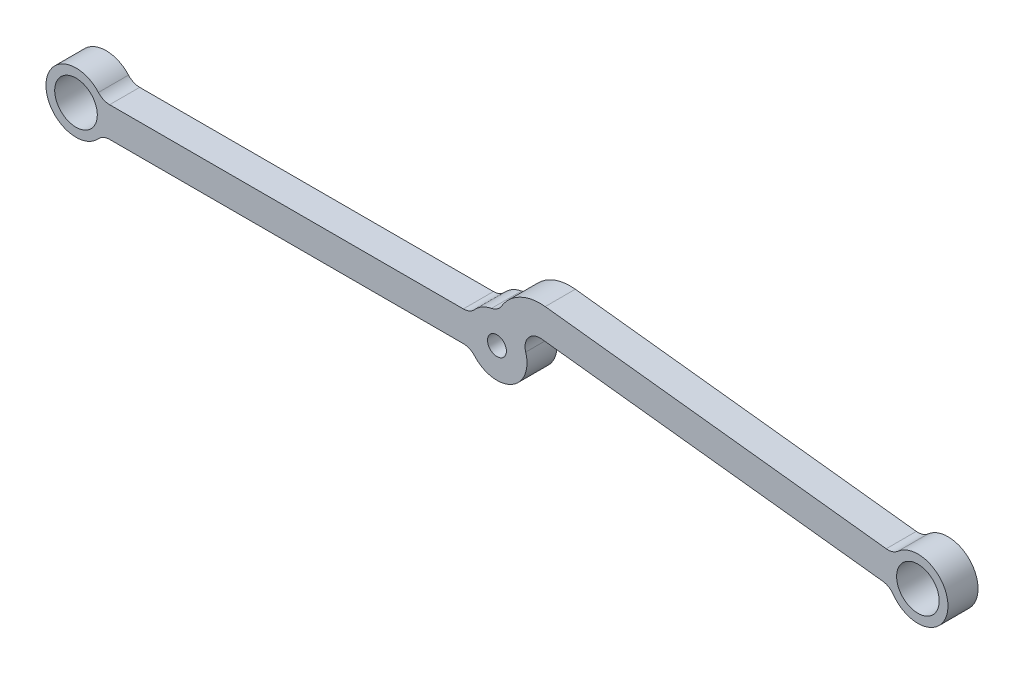
ISO-10303-21;
HEADER;
FILE_DESCRIPTION(('STEP AP214'),'2;1');
FILE_NAME('part.step','',(''),(''),'','','');
FILE_SCHEMA(('AUTOMOTIVE_DESIGN { 1 0 10303 214 1 1 1 1 }'));
ENDSEC;
DATA;
#1=APPLICATION_CONTEXT('core data for automotive mechanical design processes');
#2=APPLICATION_PROTOCOL_DEFINITION('international standard','automotive_design',2000,#1);
#3=PRODUCT_CONTEXT('',#1,'mechanical');
#4=PRODUCT('Part','Part','',(#3));
#5=PRODUCT_RELATED_PRODUCT_CATEGORY('part','',(#4));
#6=PRODUCT_DEFINITION_FORMATION('','',#4);
#7=PRODUCT_DEFINITION_CONTEXT('part definition',#1,'design');
#8=PRODUCT_DEFINITION('design','',#6,#7);
#9=PRODUCT_DEFINITION_SHAPE('','',#8);
#10=(LENGTH_UNIT() NAMED_UNIT(*) SI_UNIT(.MILLI.,.METRE.));
#11=(NAMED_UNIT(*) PLANE_ANGLE_UNIT() SI_UNIT($,.RADIAN.));
#12=(NAMED_UNIT(*) SI_UNIT($,.STERADIAN.) SOLID_ANGLE_UNIT());
#13=UNCERTAINTY_MEASURE_WITH_UNIT(LENGTH_MEASURE(1.E-05),#10,'distance_accuracy_value','');
#14=(GEOMETRIC_REPRESENTATION_CONTEXT(3) GLOBAL_UNCERTAINTY_ASSIGNED_CONTEXT((#13)) GLOBAL_UNIT_ASSIGNED_CONTEXT((#10,
#11,#12)) REPRESENTATION_CONTEXT('',''));
#15=CARTESIAN_POINT('',(0.,0.,0.));
#16=DIRECTION('',(0.,0.,1.));
#17=DIRECTION('',(1.,0.,0.));
#18=AXIS2_PLACEMENT_3D('',#15,#16,#17);
#19=CARTESIAN_POINT('',(0.79828571428571,6.93923374144195,6.35));
#20=DIRECTION('',(-0.114285714285715,-0.993447922897926,0.));
#21=DIRECTION('',(0.993447922897926,-0.114285714285715,0.));
#22=AXIS2_PLACEMENT_3D('',#19,#20,#21);
#23=PLANE('',#22);
#24=DIRECTION('',(-0.993447922897926,0.114285714285715,0.));
#25=VECTOR('',#24,1.);
#26=CARTESIAN_POINT('',(0.79828571428571,6.93923374144195,0.));
#27=LINE('',#26,#25);
#28=CARTESIAN_POINT('',(81.4841436036763,-2.342823917651,0.));
#29=VERTEX_POINT('',#28);
#30=CARTESIAN_POINT('',(9.47089404659922,5.941541547283,0.));
#31=VERTEX_POINT('',#30);
#32=EDGE_CURVE('E292',#29,#31,#27,.T.);
#33=ORIENTED_EDGE('',*,*,#32,.F.);
#34=DIRECTION('',(0.,0.,-1.));
#35=VECTOR('',#34,1.);
#36=CARTESIAN_POINT('',(81.4841436036763,-2.34282391765099,6.35));
#37=LINE('',#36,#35);
#38=CARTESIAN_POINT('',(81.4841436036763,-2.342823917651,6.35));
#39=VERTEX_POINT('',#38);
#40=EDGE_CURVE('E203',#29,#39,#37,.F.);
#41=ORIENTED_EDGE('',*,*,#40,.T.);
#42=DIRECTION('',(-0.993447922897926,0.114285714285715,0.));
#43=VECTOR('',#42,1.);
#44=CARTESIAN_POINT('',(0.79828571428571,6.93923374144195,6.35));
#45=LINE('',#44,#43);
#46=CARTESIAN_POINT('',(9.47089404659922,5.941541547283,6.35));
#47=VERTEX_POINT('',#46);
#48=EDGE_CURVE('E321',#39,#47,#45,.T.);
#49=ORIENTED_EDGE('',*,*,#48,.T.);
#50=DIRECTION('',(0.,0.,-1.));
#51=VECTOR('',#50,1.);
#52=CARTESIAN_POINT('',(9.47089404659922,5.941541547283,6.35));
#53=LINE('',#52,#51);
#54=EDGE_CURVE('E195',#47,#31,#53,.T.);
#55=ORIENTED_EDGE('',*,*,#54,.T.);
#56=EDGE_LOOP('',(#33,#41,#49,#55));
#57=FACE_BOUND('',#56,.T.);
#58=ADVANCED_FACE('F42',(#57),#23,.T.);
#59=CARTESIAN_POINT('',(88.8999999999991,0.,6.35));
#60=DIRECTION('',(0.,0.,-1.));
#61=DIRECTION('',(-1.,0.,0.));
#62=AXIS2_PLACEMENT_3D('',#59,#60,#61);
#63=CYLINDRICAL_SURFACE('',#62,6.35);
#64=CARTESIAN_POINT('',(88.8999999999991,0.,0.));
#65=DIRECTION('',(0.,0.,1.));
#66=DIRECTION('',(1.,0.,0.));
#67=AXIS2_PLACEMENT_3D('',#64,#65,#66);
#68=CIRCLE('',#67,6.35);
#69=CARTESIAN_POINT('',(83.7141909738791,-3.6646807152346,0.));
#70=VERTEX_POINT('',#69);
#71=CARTESIAN_POINT('',(84.6818100214982,4.7465116986345,0.));
#72=VERTEX_POINT('',#71);
#73=EDGE_CURVE('E294',#70,#72,#68,.T.);
#74=ORIENTED_EDGE('',*,*,#73,.T.);
#75=DIRECTION('',(0.,0.,-1.));
#76=VECTOR('',#75,1.);
#77=CARTESIAN_POINT('',(84.6818100214982,4.7465116986345,6.35));
#78=LINE('',#77,#76);
#79=CARTESIAN_POINT('',(84.6818100214982,4.7465116986345,6.35));
#80=VERTEX_POINT('',#79);
#81=EDGE_CURVE('E201',#72,#80,#78,.F.);
#82=ORIENTED_EDGE('',*,*,#81,.T.);
#83=CARTESIAN_POINT('',(88.8999999999991,0.,6.35));
#84=DIRECTION('',(0.,0.,1.));
#85=DIRECTION('',(1.,0.,0.));
#86=AXIS2_PLACEMENT_3D('',#83,#84,#85);
#87=CIRCLE('',#86,6.35);
#88=CARTESIAN_POINT('',(83.7141909738791,-3.6646807152346,6.35));
#89=VERTEX_POINT('',#88);
#90=EDGE_CURVE('E174',#89,#80,#87,.T.);
#91=ORIENTED_EDGE('',*,*,#90,.F.);
#92=DIRECTION('',(0.,0.,-1.));
#93=VECTOR('',#92,1.);
#94=CARTESIAN_POINT('',(83.7141909738791,-3.6646807152346,6.35));
#95=LINE('',#94,#93);
#96=EDGE_CURVE('E192',#89,#70,#95,.T.);
#97=ORIENTED_EDGE('',*,*,#96,.T.);
#98=EDGE_LOOP('',(#74,#82,#91,#97));
#99=FACE_BOUND('',#98,.T.);
#100=ADVANCED_FACE('F333',(#99),#63,.T.);
#101=CARTESIAN_POINT('',(1.524,13.2476280518438,6.35));
#102=DIRECTION('',(-0.114285714285715,-0.993447922897926,0.));
#103=DIRECTION('',(0.993447922897926,-0.114285714285715,0.));
#104=AXIS2_PLACEMENT_3D('',#101,#102,#103);
#105=PLANE('',#104);
#106=DIRECTION('',(-0.993447922897926,0.114285714285715,0.));
#107=VECTOR('',#106,1.);
#108=CARTESIAN_POINT('',(1.524,13.2476280518438,6.35));
#109=LINE('',#108,#107);
#110=CARTESIAN_POINT('',(82.2098578893906,3.96557039275084,6.35));
#111=VERTEX_POINT('',#110);
#112=CARTESIAN_POINT('',(10.1966083323135,12.2499358576848,6.35));
#113=VERTEX_POINT('',#112);
#114=EDGE_CURVE('E160',#111,#113,#109,.T.);
#115=ORIENTED_EDGE('',*,*,#114,.F.);
#116=DIRECTION('',(0.,0.,1.));
#117=VECTOR('',#116,1.);
#118=CARTESIAN_POINT('',(82.2098578893906,3.96557039275084,0.));
#119=LINE('',#118,#117);
#120=CARTESIAN_POINT('',(82.2098578893906,3.96557039275084,0.));
#121=VERTEX_POINT('',#120);
#122=EDGE_CURVE('E189',#111,#121,#119,.F.);
#123=ORIENTED_EDGE('',*,*,#122,.T.);
#124=DIRECTION('',(-0.993447922897926,0.114285714285715,0.));
#125=VECTOR('',#124,1.);
#126=CARTESIAN_POINT('',(1.524,13.2476280518438,0.));
#127=LINE('',#126,#125);
#128=CARTESIAN_POINT('',(10.1966083323135,12.2499358576848,0.));
#129=VERTEX_POINT('',#128);
#130=EDGE_CURVE('E187',#121,#129,#127,.T.);
#131=ORIENTED_EDGE('',*,*,#130,.T.);
#132=DIRECTION('',(0.,0.,-1.));
#133=VECTOR('',#132,1.);
#134=CARTESIAN_POINT('',(10.1966083323135,12.2499358576848,6.35));
#135=LINE('',#134,#133);
#136=EDGE_CURVE('E180',#113,#129,#135,.T.);
#137=ORIENTED_EDGE('',*,*,#136,.F.);
#138=EDGE_LOOP('',(#115,#123,#131,#137));
#139=FACE_BOUND('',#138,.T.);
#140=ADVANCED_FACE('F185',(#139),#105,.F.);
#141=CARTESIAN_POINT('',(9.10803690374207,2.78734439208206,6.35));
#142=DIRECTION('',(0.,0.,-1.));
#143=DIRECTION('',(-1.,0.,0.));
#144=AXIS2_PLACEMENT_3D('',#141,#142,#143);
#145=CYLINDRICAL_SURFACE('',#144,9.525);
#146=CARTESIAN_POINT('',(9.10803690374207,2.78734439208206,0.));
#147=DIRECTION('',(0.,0.,1.));
#148=DIRECTION('',(1.,0.,0.));
#149=AXIS2_PLACEMENT_3D('',#146,#147,#148);
#150=CIRCLE('',#149,9.525);
#151=CARTESIAN_POINT('',(0.958448455447911,7.71784468347547,0.));
#152=VERTEX_POINT('',#151);
#153=EDGE_CURVE('E298',#129,#152,#150,.T.);
#154=ORIENTED_EDGE('',*,*,#153,.T.);
#155=DIRECTION('',(0.,0.,-1.));
#156=VECTOR('',#155,1.);
#157=CARTESIAN_POINT('',(0.958448455447911,7.71784468347547,6.35));
#158=LINE('',#157,#156);
#159=CARTESIAN_POINT('',(0.958448455447911,7.71784468347547,6.35));
#160=VERTEX_POINT('',#159);
#161=EDGE_CURVE('E182',#152,#160,#158,.F.);
#162=ORIENTED_EDGE('',*,*,#161,.T.);
#163=CARTESIAN_POINT('',(9.10803690374207,2.78734439208206,6.35));
#164=DIRECTION('',(0.,0.,1.));
#165=DIRECTION('',(1.,0.,0.));
#166=AXIS2_PLACEMENT_3D('',#163,#164,#165);
#167=CIRCLE('',#166,9.525);
#168=EDGE_CURVE('E165',#113,#160,#167,.T.);
#169=ORIENTED_EDGE('',*,*,#168,.F.);
#170=ORIENTED_EDGE('',*,*,#136,.T.);
#171=EDGE_LOOP('',(#154,#162,#169,#170));
#172=FACE_BOUND('',#171,.T.);
#173=ADVANCED_FACE('F179',(#172),#145,.T.);
#174=CARTESIAN_POINT('',(-8.60422844084496E-13,0.,6.35));
#175=DIRECTION('',(0.,0.,-1.));
#176=DIRECTION('',(-1.,0.,0.));
#177=AXIS2_PLACEMENT_3D('',#174,#175,#176);
#178=CYLINDRICAL_SURFACE('',#177,6.34999999999994);
#179=CARTESIAN_POINT('',(-8.60422844084496E-13,0.,6.35));
#180=DIRECTION('',(0.,0.,1.));
#181=DIRECTION('',(1.,0.,0.));
#182=AXIS2_PLACEMENT_3D('',#179,#180,#181);
#183=CIRCLE('',#182,6.34999999999994);
#184=CARTESIAN_POINT('',(-1.17205401821149,6.24089652040438,6.35));
#185=VERTEX_POINT('',#184);
#186=CARTESIAN_POINT('',(-4.73301055237538,4.23333333333328,6.35));
#187=VERTEX_POINT('',#186);
#188=EDGE_CURVE('E183',#185,#187,#183,.T.);
#189=ORIENTED_EDGE('',*,*,#188,.F.);
#190=DIRECTION('',(0.,0.,-1.));
#191=VECTOR('',#190,1.);
#192=CARTESIAN_POINT('',(-1.17205401821149,6.24089652040438,6.35));
#193=LINE('',#192,#191);
#194=CARTESIAN_POINT('',(-1.17205401821149,6.24089652040438,0.));
#195=VERTEX_POINT('',#194);
#196=EDGE_CURVE('E207',#185,#195,#193,.T.);
#197=ORIENTED_EDGE('',*,*,#196,.T.);
#198=CARTESIAN_POINT('',(-8.60422844084496E-13,0.,0.));
#199=DIRECTION('',(0.,0.,1.));
#200=DIRECTION('',(1.,0.,0.));
#201=AXIS2_PLACEMENT_3D('',#198,#199,#200);
#202=CIRCLE('',#201,6.34999999999994);
#203=CARTESIAN_POINT('',(-4.73301055237538,4.23333333333328,0.));
#204=VERTEX_POINT('',#203);
#205=EDGE_CURVE('E266',#195,#204,#202,.T.);
#206=ORIENTED_EDGE('',*,*,#205,.T.);
#207=DIRECTION('',(0.,0.,-1.));
#208=VECTOR('',#207,1.);
#209=CARTESIAN_POINT('',(-4.73301055237538,4.23333333333328,6.35));
#210=LINE('',#209,#208);
#211=EDGE_CURVE('E205',#204,#187,#210,.F.);
#212=ORIENTED_EDGE('',*,*,#211,.T.);
#213=EDGE_LOOP('',(#189,#197,#206,#212));
#214=FACE_BOUND('',#213,.T.);
#215=ADVANCED_FACE('F349',(#214),#178,.T.);
#216=CARTESIAN_POINT('',(0.,3.17499999999994,6.35));
#217=DIRECTION('',(0.,1.,0.));
#218=DIRECTION('',(0.,0.,1.));
#219=AXIS2_PLACEMENT_3D('',#216,#217,#218);
#220=PLANE('',#219);
#221=DIRECTION('',(1.,0.,0.));
#222=VECTOR('',#221,1.);
#223=CARTESIAN_POINT('',(0.,3.17499999999994,6.35));
#224=LINE('',#223,#222);
#225=CARTESIAN_POINT('',(-81.800484171439,3.17499999999994,6.35));
#226=VERTEX_POINT('',#225);
#227=CARTESIAN_POINT('',(-7.09951582856267,3.17499999999994,6.35));
#228=VERTEX_POINT('',#227);
#229=EDGE_CURVE('E272',#226,#228,#224,.T.);
#230=ORIENTED_EDGE('',*,*,#229,.T.);
#231=DIRECTION('',(0.,0.,-1.));
#232=VECTOR('',#231,1.);
#233=CARTESIAN_POINT('',(-7.09951582856267,3.17499999999994,6.35));
#234=LINE('',#233,#232);
#235=CARTESIAN_POINT('',(-7.09951582856267,3.17499999999994,0.));
#236=VERTEX_POINT('',#235);
#237=EDGE_CURVE('E213',#228,#236,#234,.T.);
#238=ORIENTED_EDGE('',*,*,#237,.T.);
#239=DIRECTION('',(1.,0.,0.));
#240=VECTOR('',#239,1.);
#241=CARTESIAN_POINT('',(0.,3.17499999999994,0.));
#242=LINE('',#241,#240);
#243=CARTESIAN_POINT('',(-81.800484171439,3.17499999999994,0.));
#244=VERTEX_POINT('',#243);
#245=EDGE_CURVE('E257',#244,#236,#242,.T.);
#246=ORIENTED_EDGE('',*,*,#245,.F.);
#247=DIRECTION('',(0.,0.,-1.));
#248=VECTOR('',#247,1.);
#249=CARTESIAN_POINT('',(-81.800484171439,3.17499999999994,6.35));
#250=LINE('',#249,#248);
#251=EDGE_CURVE('E211',#244,#226,#250,.F.);
#252=ORIENTED_EDGE('',*,*,#251,.T.);
#253=EDGE_LOOP('',(#230,#238,#246,#252));
#254=FACE_BOUND('',#253,.T.);
#255=ADVANCED_FACE('F264',(#254),#220,.T.);
#256=CARTESIAN_POINT('',(-88.9000000000009,0.,6.35));
#257=DIRECTION('',(0.,0.,-1.));
#258=DIRECTION('',(-1.,0.,0.));
#259=AXIS2_PLACEMENT_3D('',#256,#257,#258);
#260=CYLINDRICAL_SURFACE('',#259,6.35);
#261=CARTESIAN_POINT('',(-88.9000000000009,0.,0.));
#262=DIRECTION('',(0.,0.,1.));
#263=DIRECTION('',(1.,0.,0.));
#264=AXIS2_PLACEMENT_3D('',#261,#262,#263);
#265=CIRCLE('',#264,6.35);
#266=CARTESIAN_POINT('',(-84.1669894476263,4.23333333333326,0.));
#267=VERTEX_POINT('',#266);
#268=CARTESIAN_POINT('',(-84.1669894476263,-4.23333333333339,0.));
#269=VERTEX_POINT('',#268);
#270=EDGE_CURVE('E258',#267,#269,#265,.T.);
#271=ORIENTED_EDGE('',*,*,#270,.T.);
#272=DIRECTION('',(0.,0.,-1.));
#273=VECTOR('',#272,1.);
#274=CARTESIAN_POINT('',(-84.1669894476263,-4.23333333333339,6.35));
#275=LINE('',#274,#273);
#276=CARTESIAN_POINT('',(-84.1669894476263,-4.23333333333339,6.35));
#277=VERTEX_POINT('',#276);
#278=EDGE_CURVE('E57',#269,#277,#275,.F.);
#279=ORIENTED_EDGE('',*,*,#278,.T.);
#280=CARTESIAN_POINT('',(-88.9000000000009,0.,6.35));
#281=DIRECTION('',(0.,0.,1.));
#282=DIRECTION('',(1.,0.,0.));
#283=AXIS2_PLACEMENT_3D('',#280,#281,#282);
#284=CIRCLE('',#283,6.35);
#285=CARTESIAN_POINT('',(-84.1669894476263,4.23333333333326,6.35));
#286=VERTEX_POINT('',#285);
#287=EDGE_CURVE('E269',#286,#277,#284,.T.);
#288=ORIENTED_EDGE('',*,*,#287,.F.);
#289=DIRECTION('',(0.,0.,-1.));
#290=VECTOR('',#289,1.);
#291=CARTESIAN_POINT('',(-84.1669894476263,4.23333333333326,6.35));
#292=LINE('',#291,#290);
#293=EDGE_CURVE('E224',#286,#267,#292,.T.);
#294=ORIENTED_EDGE('',*,*,#293,.T.);
#295=EDGE_LOOP('',(#271,#279,#288,#294));
#296=FACE_BOUND('',#295,.T.);
#297=ADVANCED_FACE('F268',(#296),#260,.T.);
#298=CARTESIAN_POINT('',(0.,-3.17500000000005,6.35));
#299=DIRECTION('',(0.,1.,0.));
#300=DIRECTION('',(0.,0.,1.));
#301=AXIS2_PLACEMENT_3D('',#298,#299,#300);
#302=PLANE('',#301);
#303=DIRECTION('',(1.,0.,0.));
#304=VECTOR('',#303,1.);
#305=CARTESIAN_POINT('',(0.,-3.17500000000005,0.));
#306=LINE('',#305,#304);
#307=CARTESIAN_POINT('',(-81.800484171439,-3.17500000000005,0.));
#308=VERTEX_POINT('',#307);
#309=CARTESIAN_POINT('',(-7.09951582856257,-3.17500000000005,0.));
#310=VERTEX_POINT('',#309);
#311=EDGE_CURVE('E302',#308,#310,#306,.T.);
#312=ORIENTED_EDGE('',*,*,#311,.T.);
#313=DIRECTION('',(0.,0.,1.));
#314=VECTOR('',#313,1.);
#315=CARTESIAN_POINT('',(-7.09951582856257,-3.17500000000005,6.35));
#316=LINE('',#315,#314);
#317=CARTESIAN_POINT('',(-7.09951582856257,-3.17500000000005,6.35));
#318=VERTEX_POINT('',#317);
#319=EDGE_CURVE('E222',#310,#318,#316,.T.);
#320=ORIENTED_EDGE('',*,*,#319,.T.);
#321=DIRECTION('',(1.,0.,0.));
#322=VECTOR('',#321,1.);
#323=CARTESIAN_POINT('',(0.,-3.17500000000005,6.35));
#324=LINE('',#323,#322);
#325=CARTESIAN_POINT('',(-81.800484171439,-3.17500000000005,6.35));
#326=VERTEX_POINT('',#325);
#327=EDGE_CURVE('E271',#326,#318,#324,.T.);
#328=ORIENTED_EDGE('',*,*,#327,.F.);
#329=DIRECTION('',(0.,0.,1.));
#330=VECTOR('',#329,1.);
#331=CARTESIAN_POINT('',(-81.800484171439,-3.17500000000005,0.));
#332=LINE('',#331,#330);
#333=EDGE_CURVE('E219',#326,#308,#332,.F.);
#334=ORIENTED_EDGE('',*,*,#333,.T.);
#335=EDGE_LOOP('',(#312,#320,#328,#334));
#336=FACE_BOUND('',#335,.T.);
#337=ADVANCED_FACE('F399',(#336),#302,.F.);
#338=CARTESIAN_POINT('',(-4.73301055237532,-4.23333333333336,6.35));
#339=VERTEX_POINT('',#338);
#340=CARTESIAN_POINT('',(6.07202460249415,1.85822959472129,6.35));
#341=VERTEX_POINT('',#340);
#342=EDGE_CURVE('E275',#339,#341,#183,.T.);
#343=ORIENTED_EDGE('',*,*,#342,.F.);
#344=DIRECTION('',(0.,0.,-1.));
#345=VECTOR('',#344,1.);
#346=CARTESIAN_POINT('',(-4.73301055237532,-4.23333333333336,6.35));
#347=LINE('',#346,#345);
#348=CARTESIAN_POINT('',(-4.73301055237532,-4.23333333333336,0.));
#349=VERTEX_POINT('',#348);
#350=EDGE_CURVE('E216',#339,#349,#347,.T.);
#351=ORIENTED_EDGE('',*,*,#350,.T.);
#352=CARTESIAN_POINT('',(6.07202460249415,1.85822959472129,0.));
#353=VERTEX_POINT('',#352);
#354=EDGE_CURVE('E300',#349,#353,#202,.T.);
#355=ORIENTED_EDGE('',*,*,#354,.T.);
#356=DIRECTION('',(0.,0.,-1.));
#357=VECTOR('',#356,1.);
#358=CARTESIAN_POINT('',(6.07202460249415,1.85822959472129,6.35));
#359=LINE('',#358,#357);
#360=EDGE_CURVE('E190',#341,#353,#359,.T.);
#361=ORIENTED_EDGE('',*,*,#360,.F.);
#362=EDGE_LOOP('',(#343,#351,#355,#361));
#363=FACE_BOUND('',#362,.T.);
#364=ADVANCED_FACE('F394',(#363),#178,.T.);
#365=CARTESIAN_POINT('',(-8.60422844084496E-13,0.,6.35));
#366=DIRECTION('',(0.,0.,-1.));
#367=DIRECTION('',(-1.,0.,0.));
#368=AXIS2_PLACEMENT_3D('',#365,#366,#367);
#369=CYLINDRICAL_SURFACE('',#368,1.9939);
#370=CARTESIAN_POINT('',(-8.60422844084496E-13,0.,6.35));
#371=DIRECTION('',(0.,0.,1.));
#372=DIRECTION('',(1.,0.,0.));
#373=AXIS2_PLACEMENT_3D('',#370,#371,#372);
#374=CIRCLE('',#373,1.9939);
#375=CARTESIAN_POINT('',(1.99389999999914,0.,6.35));
#376=VERTEX_POINT('',#375);
#377=EDGE_CURVE('E283',#376,#376,#374,.T.);
#378=ORIENTED_EDGE('',*,*,#377,.T.);
#379=EDGE_LOOP('',(#378));
#380=FACE_BOUND('',#379,.T.);
#381=CARTESIAN_POINT('',(-8.60422844084496E-13,0.,0.));
#382=DIRECTION('',(0.,0.,1.));
#383=DIRECTION('',(1.,0.,0.));
#384=AXIS2_PLACEMENT_3D('',#381,#382,#383);
#385=CIRCLE('',#384,1.9939);
#386=CARTESIAN_POINT('',(1.99389999999914,0.,0.));
#387=VERTEX_POINT('',#386);
#388=EDGE_CURVE('E309',#387,#387,#385,.T.);
#389=ORIENTED_EDGE('',*,*,#388,.F.);
#390=EDGE_LOOP('',(#389));
#391=FACE_BOUND('',#390,.T.);
#392=ADVANCED_FACE('F381',(#380,#391),#369,.F.);
#393=CARTESIAN_POINT('',(9.10803690374207,2.78734439208206,6.35));
#394=DIRECTION('',(0.,0.,-1.));
#395=DIRECTION('',(-1.,0.,0.));
#396=AXIS2_PLACEMENT_3D('',#393,#394,#395);
#397=CYLINDRICAL_SURFACE('',#396,3.175);
#398=CARTESIAN_POINT('',(9.10803690374207,2.78734439208206,0.));
#399=DIRECTION('',(0.,0.,1.));
#400=DIRECTION('',(1.,0.,0.));
#401=AXIS2_PLACEMENT_3D('',#398,#399,#400);
#402=CIRCLE('',#401,3.175);
#403=EDGE_CURVE('E301',#31,#353,#402,.T.);
#404=ORIENTED_EDGE('',*,*,#403,.F.);
#405=ORIENTED_EDGE('',*,*,#54,.F.);
#406=CARTESIAN_POINT('',(9.10803690374207,2.78734439208206,6.35));
#407=DIRECTION('',(0.,0.,1.));
#408=DIRECTION('',(1.,0.,0.));
#409=AXIS2_PLACEMENT_3D('',#406,#407,#408);
#410=CIRCLE('',#409,3.175);
#411=EDGE_CURVE('E280',#47,#341,#410,.T.);
#412=ORIENTED_EDGE('',*,*,#411,.T.);
#413=ORIENTED_EDGE('',*,*,#360,.T.);
#414=EDGE_LOOP('',(#404,#405,#412,#413));
#415=FACE_BOUND('',#414,.T.);
#416=ADVANCED_FACE('F324',(#415),#397,.F.);
#417=CARTESIAN_POINT('',(88.8999999999991,0.,6.35));
#418=DIRECTION('',(0.,0.,-1.));
#419=DIRECTION('',(-1.,0.,0.));
#420=AXIS2_PLACEMENT_3D('',#417,#418,#419);
#421=CYLINDRICAL_SURFACE('',#420,4.49961);
#422=CARTESIAN_POINT('',(88.8999999999991,0.,6.35));
#423=DIRECTION('',(0.,0.,1.));
#424=DIRECTION('',(1.,0.,0.));
#425=AXIS2_PLACEMENT_3D('',#422,#423,#424);
#426=CIRCLE('',#425,4.49961);
#427=CARTESIAN_POINT('',(93.3996099999991,0.,6.35));
#428=VERTEX_POINT('',#427);
#429=EDGE_CURVE('E314',#428,#428,#426,.T.);
#430=ORIENTED_EDGE('',*,*,#429,.T.);
#431=EDGE_LOOP('',(#430));
#432=FACE_BOUND('',#431,.T.);
#433=CARTESIAN_POINT('',(88.8999999999991,0.,0.));
#434=DIRECTION('',(0.,0.,1.));
#435=DIRECTION('',(1.,0.,0.));
#436=AXIS2_PLACEMENT_3D('',#433,#434,#435);
#437=CIRCLE('',#436,4.49961);
#438=CARTESIAN_POINT('',(93.3996099999991,0.,0.));
#439=VERTEX_POINT('',#438);
#440=EDGE_CURVE('E289',#439,#439,#437,.T.);
#441=ORIENTED_EDGE('',*,*,#440,.F.);
#442=EDGE_LOOP('',(#441));
#443=FACE_BOUND('',#442,.T.);
#444=ADVANCED_FACE('F371',(#432,#443),#421,.F.);
#445=CARTESIAN_POINT('',(-88.9000000000009,0.,6.35));
#446=DIRECTION('',(0.,0.,-1.));
#447=DIRECTION('',(-1.,0.,0.));
#448=AXIS2_PLACEMENT_3D('',#445,#446,#447);
#449=CYLINDRICAL_SURFACE('',#448,4.49961);
#450=CARTESIAN_POINT('',(-88.9000000000009,0.,6.35));
#451=DIRECTION('',(0.,0.,1.));
#452=DIRECTION('',(1.,0.,0.));
#453=AXIS2_PLACEMENT_3D('',#450,#451,#452);
#454=CIRCLE('',#453,4.49961);
#455=CARTESIAN_POINT('',(-84.4003900000009,0.,6.35));
#456=VERTEX_POINT('',#455);
#457=EDGE_CURVE('E286',#456,#456,#454,.T.);
#458=ORIENTED_EDGE('',*,*,#457,.T.);
#459=EDGE_LOOP('',(#458));
#460=FACE_BOUND('',#459,.T.);
#461=CARTESIAN_POINT('',(-88.9000000000009,0.,0.));
#462=DIRECTION('',(0.,0.,1.));
#463=DIRECTION('',(1.,0.,0.));
#464=AXIS2_PLACEMENT_3D('',#461,#462,#463);
#465=CIRCLE('',#464,4.49961);
#466=CARTESIAN_POINT('',(-84.4003900000009,0.,0.));
#467=VERTEX_POINT('',#466);
#468=EDGE_CURVE('E312',#467,#467,#465,.T.);
#469=ORIENTED_EDGE('',*,*,#468,.F.);
#470=EDGE_LOOP('',(#469));
#471=FACE_BOUND('',#470,.T.);
#472=ADVANCED_FACE('F373',(#460,#471),#449,.F.);
#473=CARTESIAN_POINT('',(0.,0.,6.35));
#474=DIRECTION('',(0.,0.,1.));
#475=DIRECTION('',(1.,0.,0.));
#476=AXIS2_PLACEMENT_3D('',#473,#474,#475);
#477=PLANE('',#476);
#478=ORIENTED_EDGE('',*,*,#429,.F.);
#479=EDGE_LOOP('',(#478));
#480=FACE_BOUND('',#479,.T.);
#481=ORIENTED_EDGE('',*,*,#48,.F.);
#482=CARTESIAN_POINT('',(81.1212864608191,-5.4970210728519,6.35));
#483=DIRECTION('',(0.,0.,1.));
#484=DIRECTION('',(1.,0.,0.));
#485=AXIS2_PLACEMENT_3D('',#482,#483,#484);
#486=CIRCLE('',#485,3.175);
#487=EDGE_CURVE('E233',#39,#89,#486,.F.);
#488=ORIENTED_EDGE('',*,*,#487,.T.);
#489=ORIENTED_EDGE('',*,*,#90,.T.);
#490=CARTESIAN_POINT('',(82.5727150322477,7.11976754795176,6.35));
#491=DIRECTION('',(0.,0.,1.));
#492=DIRECTION('',(1.,0.,0.));
#493=AXIS2_PLACEMENT_3D('',#490,#491,#492);
#494=CIRCLE('',#493,3.175);
#495=EDGE_CURVE('E169',#80,#111,#494,.F.);
#496=ORIENTED_EDGE('',*,*,#495,.T.);
#497=ORIENTED_EDGE('',*,*,#114,.T.);
#498=ORIENTED_EDGE('',*,*,#168,.T.);
#499=CARTESIAN_POINT('',(-1.75808102731681,9.3613447806066,6.35));
#500=DIRECTION('',(0.,0.,1.));
#501=DIRECTION('',(1.,0.,0.));
#502=AXIS2_PLACEMENT_3D('',#499,#500,#501);
#503=CIRCLE('',#502,3.175);
#504=EDGE_CURVE('E237',#160,#185,#503,.F.);
#505=ORIENTED_EDGE('',*,*,#504,.T.);
#506=ORIENTED_EDGE('',*,*,#188,.T.);
#507=CARTESIAN_POINT('',(-7.09951582856267,6.34999999999994,6.35));
#508=DIRECTION('',(0.,0.,1.));
#509=DIRECTION('',(1.,0.,0.));
#510=AXIS2_PLACEMENT_3D('',#507,#508,#509);
#511=CIRCLE('',#510,3.175);
#512=EDGE_CURVE('E241',#187,#228,#511,.F.);
#513=ORIENTED_EDGE('',*,*,#512,.T.);
#514=ORIENTED_EDGE('',*,*,#229,.F.);
#515=CARTESIAN_POINT('',(-81.800484171439,6.34999999999994,6.35));
#516=DIRECTION('',(0.,0.,1.));
#517=DIRECTION('',(1.,0.,0.));
#518=AXIS2_PLACEMENT_3D('',#515,#516,#517);
#519=CIRCLE('',#518,3.175);
#520=EDGE_CURVE('E11',#226,#286,#519,.F.);
#521=ORIENTED_EDGE('',*,*,#520,.T.);
#522=ORIENTED_EDGE('',*,*,#287,.T.);
#523=CARTESIAN_POINT('',(-81.800484171439,-6.35000000000005,6.35));
#524=DIRECTION('',(0.,0.,1.));
#525=DIRECTION('',(1.,0.,0.));
#526=AXIS2_PLACEMENT_3D('',#523,#524,#525);
#527=CIRCLE('',#526,3.175);
#528=EDGE_CURVE('E249',#277,#326,#527,.F.);
#529=ORIENTED_EDGE('',*,*,#528,.T.);
#530=ORIENTED_EDGE('',*,*,#327,.T.);
#531=CARTESIAN_POINT('',(-7.09951582856257,-6.35000000000005,6.35));
#532=DIRECTION('',(0.,0.,1.));
#533=DIRECTION('',(1.,0.,0.));
#534=AXIS2_PLACEMENT_3D('',#531,#532,#533);
#535=CIRCLE('',#534,3.175);
#536=EDGE_CURVE('E245',#318,#339,#535,.F.);
#537=ORIENTED_EDGE('',*,*,#536,.T.);
#538=ORIENTED_EDGE('',*,*,#342,.T.);
#539=ORIENTED_EDGE('',*,*,#411,.F.);
#540=EDGE_LOOP('',(#481,#488,#489,#496,#497,#498,#505,#506,#513,#514,#521,#522,#529,#530,#537,
#538,#539));
#541=FACE_BOUND('',#540,.T.);
#542=ORIENTED_EDGE('',*,*,#377,.F.);
#543=EDGE_LOOP('',(#542));
#544=FACE_BOUND('',#543,.T.);
#545=ORIENTED_EDGE('',*,*,#457,.F.);
#546=EDGE_LOOP('',(#545));
#547=FACE_BOUND('',#546,.T.);
#548=ADVANCED_FACE('F163',(#480,#541,#544,#547),#477,.T.);
#549=CARTESIAN_POINT('',(0.,0.,0.));
#550=DIRECTION('',(0.,0.,1.));
#551=DIRECTION('',(1.,0.,0.));
#552=AXIS2_PLACEMENT_3D('',#549,#550,#551);
#553=PLANE('',#552);
#554=ORIENTED_EDGE('',*,*,#440,.T.);
#555=EDGE_LOOP('',(#554));
#556=FACE_BOUND('',#555,.T.);
#557=ORIENTED_EDGE('',*,*,#73,.F.);
#558=CARTESIAN_POINT('',(81.1212864608191,-5.4970210728519,0.));
#559=DIRECTION('',(0.,0.,1.));
#560=DIRECTION('',(1.,0.,0.));
#561=AXIS2_PLACEMENT_3D('',#558,#559,#560);
#562=CIRCLE('',#561,3.175);
#563=EDGE_CURVE('E231',#70,#29,#562,.T.);
#564=ORIENTED_EDGE('',*,*,#563,.T.);
#565=ORIENTED_EDGE('',*,*,#32,.T.);
#566=ORIENTED_EDGE('',*,*,#403,.T.);
#567=ORIENTED_EDGE('',*,*,#354,.F.);
#568=CARTESIAN_POINT('',(-7.09951582856257,-6.35000000000005,0.));
#569=DIRECTION('',(0.,0.,1.));
#570=DIRECTION('',(1.,0.,0.));
#571=AXIS2_PLACEMENT_3D('',#568,#569,#570);
#572=CIRCLE('',#571,3.175);
#573=EDGE_CURVE('E243',#349,#310,#572,.T.);
#574=ORIENTED_EDGE('',*,*,#573,.T.);
#575=ORIENTED_EDGE('',*,*,#311,.F.);
#576=CARTESIAN_POINT('',(-81.800484171439,-6.35000000000005,0.));
#577=DIRECTION('',(0.,0.,1.));
#578=DIRECTION('',(1.,0.,0.));
#579=AXIS2_PLACEMENT_3D('',#576,#577,#578);
#580=CIRCLE('',#579,3.175);
#581=EDGE_CURVE('E247',#308,#269,#580,.T.);
#582=ORIENTED_EDGE('',*,*,#581,.T.);
#583=ORIENTED_EDGE('',*,*,#270,.F.);
#584=CARTESIAN_POINT('',(-81.800484171439,6.34999999999994,0.));
#585=DIRECTION('',(0.,0.,1.));
#586=DIRECTION('',(1.,0.,0.));
#587=AXIS2_PLACEMENT_3D('',#584,#585,#586);
#588=CIRCLE('',#587,3.175);
#589=EDGE_CURVE('E50',#267,#244,#588,.T.);
#590=ORIENTED_EDGE('',*,*,#589,.T.);
#591=ORIENTED_EDGE('',*,*,#245,.T.);
#592=CARTESIAN_POINT('',(-7.09951582856267,6.34999999999994,0.));
#593=DIRECTION('',(0.,0.,1.));
#594=DIRECTION('',(1.,0.,0.));
#595=AXIS2_PLACEMENT_3D('',#592,#593,#594);
#596=CIRCLE('',#595,3.175);
#597=EDGE_CURVE('E239',#236,#204,#596,.T.);
#598=ORIENTED_EDGE('',*,*,#597,.T.);
#599=ORIENTED_EDGE('',*,*,#205,.F.);
#600=CARTESIAN_POINT('',(-1.75808102731681,9.3613447806066,0.));
#601=DIRECTION('',(0.,0.,1.));
#602=DIRECTION('',(1.,0.,0.));
#603=AXIS2_PLACEMENT_3D('',#600,#601,#602);
#604=CIRCLE('',#603,3.175);
#605=EDGE_CURVE('E235',#195,#152,#604,.T.);
#606=ORIENTED_EDGE('',*,*,#605,.T.);
#607=ORIENTED_EDGE('',*,*,#153,.F.);
#608=ORIENTED_EDGE('',*,*,#130,.F.);
#609=CARTESIAN_POINT('',(82.5727150322477,7.11976754795176,0.));
#610=DIRECTION('',(0.,0.,1.));
#611=DIRECTION('',(1.,0.,0.));
#612=AXIS2_PLACEMENT_3D('',#609,#610,#611);
#613=CIRCLE('',#612,3.175);
#614=EDGE_CURVE('E228',#121,#72,#613,.T.);
#615=ORIENTED_EDGE('',*,*,#614,.T.);
#616=EDGE_LOOP('',(#557,#564,#565,#566,#567,#574,#575,#582,#583,#590,#591,#598,#599,#606,#607,
#608,#615));
#617=FACE_BOUND('',#616,.T.);
#618=ORIENTED_EDGE('',*,*,#388,.T.);
#619=EDGE_LOOP('',(#618));
#620=FACE_BOUND('',#619,.T.);
#621=ORIENTED_EDGE('',*,*,#468,.T.);
#622=EDGE_LOOP('',(#621));
#623=FACE_BOUND('',#622,.T.);
#624=ADVANCED_FACE('F255',(#556,#617,#620,#623),#553,.F.);
#625=CARTESIAN_POINT('',(82.5727150322477,7.11976754795176,6.35));
#626=DIRECTION('',(0.,0.,-1.));
#627=DIRECTION('',(-1.,0.,0.));
#628=AXIS2_PLACEMENT_3D('',#625,#626,#627);
#629=CYLINDRICAL_SURFACE('',#628,3.175);
#630=ORIENTED_EDGE('',*,*,#495,.F.);
#631=ORIENTED_EDGE('',*,*,#81,.F.);
#632=ORIENTED_EDGE('',*,*,#614,.F.);
#633=ORIENTED_EDGE('',*,*,#122,.F.);
#634=EDGE_LOOP('',(#630,#631,#632,#633));
#635=FACE_BOUND('',#634,.T.);
#636=ADVANCED_FACE('F353',(#635),#629,.F.);
#637=CARTESIAN_POINT('',(81.1212864608191,-5.4970210728519,6.35));
#638=DIRECTION('',(0.,0.,-1.));
#639=DIRECTION('',(-1.,0.,0.));
#640=AXIS2_PLACEMENT_3D('',#637,#638,#639);
#641=CYLINDRICAL_SURFACE('',#640,3.175);
#642=ORIENTED_EDGE('',*,*,#487,.F.);
#643=ORIENTED_EDGE('',*,*,#40,.F.);
#644=ORIENTED_EDGE('',*,*,#563,.F.);
#645=ORIENTED_EDGE('',*,*,#96,.F.);
#646=EDGE_LOOP('',(#642,#643,#644,#645));
#647=FACE_BOUND('',#646,.T.);
#648=ADVANCED_FACE('F330',(#647),#641,.F.);
#649=CARTESIAN_POINT('',(-1.75808102731681,9.3613447806066,6.35));
#650=DIRECTION('',(0.,0.,1.));
#651=DIRECTION('',(1.,0.,0.));
#652=AXIS2_PLACEMENT_3D('',#649,#650,#651);
#653=CYLINDRICAL_SURFACE('',#652,3.175);
#654=ORIENTED_EDGE('',*,*,#504,.F.);
#655=ORIENTED_EDGE('',*,*,#161,.F.);
#656=ORIENTED_EDGE('',*,*,#605,.F.);
#657=ORIENTED_EDGE('',*,*,#196,.F.);
#658=EDGE_LOOP('',(#654,#655,#656,#657));
#659=FACE_BOUND('',#658,.T.);
#660=ADVANCED_FACE('F351',(#659),#653,.F.);
#661=CARTESIAN_POINT('',(-7.09951582856267,6.34999999999994,6.35));
#662=DIRECTION('',(0.,0.,-1.));
#663=DIRECTION('',(-1.,0.,0.));
#664=AXIS2_PLACEMENT_3D('',#661,#662,#663);
#665=CYLINDRICAL_SURFACE('',#664,3.175);
#666=ORIENTED_EDGE('',*,*,#512,.F.);
#667=ORIENTED_EDGE('',*,*,#211,.F.);
#668=ORIENTED_EDGE('',*,*,#597,.F.);
#669=ORIENTED_EDGE('',*,*,#237,.F.);
#670=EDGE_LOOP('',(#666,#667,#668,#669));
#671=FACE_BOUND('',#670,.T.);
#672=ADVANCED_FACE('F346',(#671),#665,.F.);
#673=CARTESIAN_POINT('',(-7.09951582856257,-6.35000000000005,6.35));
#674=DIRECTION('',(0.,0.,-1.));
#675=DIRECTION('',(-1.,0.,0.));
#676=AXIS2_PLACEMENT_3D('',#673,#674,#675);
#677=CYLINDRICAL_SURFACE('',#676,3.175);
#678=ORIENTED_EDGE('',*,*,#536,.F.);
#679=ORIENTED_EDGE('',*,*,#319,.F.);
#680=ORIENTED_EDGE('',*,*,#573,.F.);
#681=ORIENTED_EDGE('',*,*,#350,.F.);
#682=EDGE_LOOP('',(#678,#679,#680,#681));
#683=FACE_BOUND('',#682,.T.);
#684=ADVANCED_FACE('F639',(#683),#677,.F.);
#685=CARTESIAN_POINT('',(-81.800484171439,-6.35000000000005,6.35));
#686=DIRECTION('',(0.,0.,-1.));
#687=DIRECTION('',(-1.,0.,0.));
#688=AXIS2_PLACEMENT_3D('',#685,#686,#687);
#689=CYLINDRICAL_SURFACE('',#688,3.175);
#690=ORIENTED_EDGE('',*,*,#528,.F.);
#691=ORIENTED_EDGE('',*,*,#278,.F.);
#692=ORIENTED_EDGE('',*,*,#581,.F.);
#693=ORIENTED_EDGE('',*,*,#333,.F.);
#694=EDGE_LOOP('',(#690,#691,#692,#693));
#695=FACE_BOUND('',#694,.T.);
#696=ADVANCED_FACE('F647',(#695),#689,.F.);
#697=CARTESIAN_POINT('',(-81.800484171439,6.34999999999994,6.35));
#698=DIRECTION('',(0.,0.,-1.));
#699=DIRECTION('',(-1.,0.,0.));
#700=AXIS2_PLACEMENT_3D('',#697,#698,#699);
#701=CYLINDRICAL_SURFACE('',#700,3.175);
#702=ORIENTED_EDGE('',*,*,#520,.F.);
#703=ORIENTED_EDGE('',*,*,#251,.F.);
#704=ORIENTED_EDGE('',*,*,#589,.F.);
#705=ORIENTED_EDGE('',*,*,#293,.F.);
#706=EDGE_LOOP('',(#702,#703,#704,#705));
#707=FACE_BOUND('',#706,.T.);
#708=ADVANCED_FACE('F44',(#707),#701,.F.);
#709=CLOSED_SHELL('',(#58,#100,#140,#173,#215,#255,#297,#337,#364,#392,#416,#444,#472,#548,#624,
#636,#648,#660,#672,#684,#696,#708));
#710=MANIFOLD_SOLID_BREP('B2',#709);
#711=ADVANCED_BREP_SHAPE_REPRESENTATION('',(#18,#710),#14);
#712=SHAPE_DEFINITION_REPRESENTATION(#9,#711);
ENDSEC;
END-ISO-10303-21;
